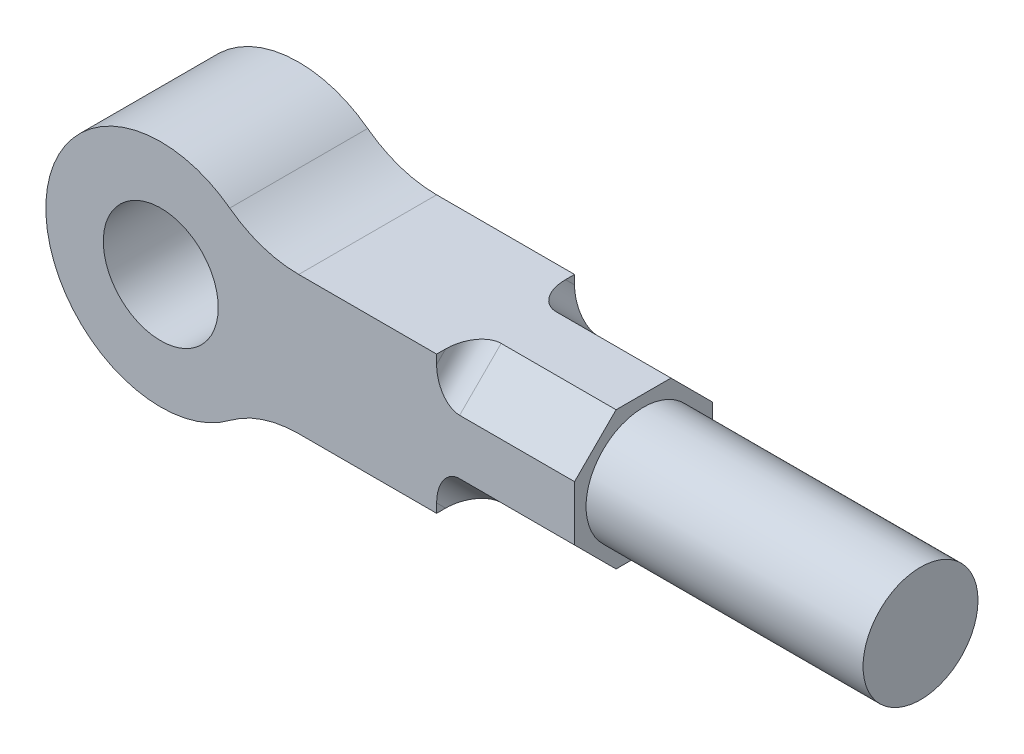
ISO-10303-21;
HEADER;
FILE_DESCRIPTION(('STEP AP214'),'2;1');
FILE_NAME('part.step','',(''),(''),'','','');
FILE_SCHEMA(('AUTOMOTIVE_DESIGN { 1 0 10303 214 1 1 1 1 }'));
ENDSEC;
DATA;
#1=APPLICATION_CONTEXT('core data for automotive mechanical design processes');
#2=APPLICATION_PROTOCOL_DEFINITION('international standard','automotive_design',2000,#1);
#3=PRODUCT_CONTEXT('',#1,'mechanical');
#4=PRODUCT('Part','Part','',(#3));
#5=PRODUCT_RELATED_PRODUCT_CATEGORY('part','',(#4));
#6=PRODUCT_DEFINITION_FORMATION('','',#4);
#7=PRODUCT_DEFINITION_CONTEXT('part definition',#1,'design');
#8=PRODUCT_DEFINITION('design','',#6,#7);
#9=PRODUCT_DEFINITION_SHAPE('','',#8);
#10=(LENGTH_UNIT() NAMED_UNIT(*) SI_UNIT(.MILLI.,.METRE.));
#11=(NAMED_UNIT(*) PLANE_ANGLE_UNIT() SI_UNIT($,.RADIAN.));
#12=(NAMED_UNIT(*) SI_UNIT($,.STERADIAN.) SOLID_ANGLE_UNIT());
#13=UNCERTAINTY_MEASURE_WITH_UNIT(LENGTH_MEASURE(1.E-05),#10,'distance_accuracy_value','');
#14=(GEOMETRIC_REPRESENTATION_CONTEXT(3) GLOBAL_UNCERTAINTY_ASSIGNED_CONTEXT((#13)) GLOBAL_UNIT_ASSIGNED_CONTEXT((#10,
#11,#12)) REPRESENTATION_CONTEXT('',''));
#15=CARTESIAN_POINT('',(0.,0.,0.));
#16=DIRECTION('',(0.,0.,1.));
#17=DIRECTION('',(1.,0.,0.));
#18=AXIS2_PLACEMENT_3D('',#15,#16,#17);
#19=CARTESIAN_POINT('',(60.,-80.,60.));
#20=DIRECTION('',(0.,0.,-1.));
#21=DIRECTION('',(-1.,0.,0.));
#22=AXIS2_PLACEMENT_3D('',#19,#20,#21);
#23=PLANE('',#22);
#24=DIRECTION('',(0.,-1.,0.));
#25=VECTOR('',#24,1.);
#26=CARTESIAN_POINT('',(120.,0.,60.));
#27=LINE('',#26,#25);
#28=CARTESIAN_POINT('',(120.,-26.0821356237304,60.));
#29=VERTEX_POINT('',#28);
#30=CARTESIAN_POINT('',(120.,-30.,60.));
#31=VERTEX_POINT('',#30);
#32=EDGE_CURVE('E294',#29,#31,#27,.T.);
#33=ORIENTED_EDGE('',*,*,#32,.F.);
#34=CARTESIAN_POINT('',(130.,-26.0821356237304,60.));
#35=DIRECTION('',(0.,0.,-1.));
#36=DIRECTION('',(0.,1.,0.));
#37=AXIS2_PLACEMENT_3D('',#34,#35,#36);
#38=ELLIPSE('',#37,14.142135623731,10.);
#39=CARTESIAN_POINT('',(130.,-11.9399999999994,60.));
#40=VERTEX_POINT('',#39);
#41=EDGE_CURVE('E239',#29,#40,#38,.T.);
#42=ORIENTED_EDGE('',*,*,#41,.T.);
#43=DIRECTION('',(1.,0.,0.));
#44=VECTOR('',#43,1.);
#45=CARTESIAN_POINT('',(120.,-11.9399999999994,60.));
#46=LINE('',#45,#44);
#47=CARTESIAN_POINT('',(180.,-11.9399999999994,60.));
#48=VERTEX_POINT('',#47);
#49=EDGE_CURVE('E285',#40,#48,#46,.T.);
#50=ORIENTED_EDGE('',*,*,#49,.T.);
#51=DIRECTION('',(0.,1.,0.));
#52=VECTOR('',#51,1.);
#53=CARTESIAN_POINT('',(180.,30.,60.));
#54=LINE('',#53,#52);
#55=CARTESIAN_POINT('',(180.,11.9399999999994,60.));
#56=VERTEX_POINT('',#55);
#57=EDGE_CURVE('E338',#48,#56,#54,.T.);
#58=ORIENTED_EDGE('',*,*,#57,.T.);
#59=DIRECTION('',(1.,0.,0.));
#60=VECTOR('',#59,1.);
#61=CARTESIAN_POINT('',(120.,11.9399999999994,60.));
#62=LINE('',#61,#60);
#63=CARTESIAN_POINT('',(130.,11.9399999999994,60.));
#64=VERTEX_POINT('',#63);
#65=EDGE_CURVE('E313',#64,#56,#62,.T.);
#66=ORIENTED_EDGE('',*,*,#65,.F.);
#67=CARTESIAN_POINT('',(130.,26.0821356237302,60.));
#68=DIRECTION('',(0.,0.,-1.));
#69=DIRECTION('',(0.,1.,0.));
#70=AXIS2_PLACEMENT_3D('',#67,#68,#69);
#71=ELLIPSE('',#70,14.1421356237308,10.);
#72=CARTESIAN_POINT('',(120.,26.0821356237302,60.));
#73=VERTEX_POINT('',#72);
#74=EDGE_CURVE('E11',#64,#73,#71,.T.);
#75=ORIENTED_EDGE('',*,*,#74,.T.);
#76=DIRECTION('',(0.,-1.,0.));
#77=VECTOR('',#76,1.);
#78=CARTESIAN_POINT('',(120.,0.,60.));
#79=LINE('',#78,#77);
#80=CARTESIAN_POINT('',(120.,30.,60.));
#81=VERTEX_POINT('',#80);
#82=EDGE_CURVE('E306',#81,#73,#79,.T.);
#83=ORIENTED_EDGE('',*,*,#82,.F.);
#84=DIRECTION('',(-1.,0.,0.));
#85=VECTOR('',#84,1.);
#86=CARTESIAN_POINT('',(60.,30.,60.));
#87=LINE('',#86,#85);
#88=CARTESIAN_POINT('',(60.,30.,60.));
#89=VERTEX_POINT('',#88);
#90=EDGE_CURVE('E342',#81,#89,#87,.T.);
#91=ORIENTED_EDGE('',*,*,#90,.T.);
#92=CARTESIAN_POINT('',(60.,80.,60.));
#93=DIRECTION('',(0.,0.,-1.));
#94=DIRECTION('',(-1.,0.,0.));
#95=AXIS2_PLACEMENT_3D('',#92,#93,#94);
#96=CIRCLE('',#95,50.);
#97=CARTESIAN_POINT('',(30.,40.,60.));
#98=VERTEX_POINT('',#97);
#99=EDGE_CURVE('E345',#89,#98,#96,.T.);
#100=ORIENTED_EDGE('',*,*,#99,.T.);
#101=CARTESIAN_POINT('',(0.,0.,60.));
#102=DIRECTION('',(0.,0.,1.));
#103=DIRECTION('',(1.,0.,0.));
#104=AXIS2_PLACEMENT_3D('',#101,#102,#103);
#105=CIRCLE('',#104,50.);
#106=CARTESIAN_POINT('',(30.,-40.,60.));
#107=VERTEX_POINT('',#106);
#108=EDGE_CURVE('E348',#98,#107,#105,.T.);
#109=ORIENTED_EDGE('',*,*,#108,.T.);
#110=CARTESIAN_POINT('',(60.,-80.,60.));
#111=DIRECTION('',(0.,0.,-1.));
#112=DIRECTION('',(-1.,0.,0.));
#113=AXIS2_PLACEMENT_3D('',#110,#111,#112);
#114=CIRCLE('',#113,50.);
#115=CARTESIAN_POINT('',(60.,-30.,60.));
#116=VERTEX_POINT('',#115);
#117=EDGE_CURVE('E329',#107,#116,#114,.T.);
#118=ORIENTED_EDGE('',*,*,#117,.T.);
#119=DIRECTION('',(1.,0.,0.));
#120=VECTOR('',#119,1.);
#121=CARTESIAN_POINT('',(60.,-30.,60.));
#122=LINE('',#121,#120);
#123=EDGE_CURVE('E333',#116,#31,#122,.T.);
#124=ORIENTED_EDGE('',*,*,#123,.T.);
#125=EDGE_LOOP('',(#33,#42,#50,#58,#66,#75,#83,#91,#100,#109,#118,#124));
#126=FACE_BOUND('',#125,.T.);
#127=CARTESIAN_POINT('',(0.,0.,60.));
#128=DIRECTION('',(0.,0.,1.));
#129=DIRECTION('',(1.,0.,0.));
#130=AXIS2_PLACEMENT_3D('',#127,#128,#129);
#131=CIRCLE('',#130,25.);
#132=CARTESIAN_POINT('',(25.,0.,60.));
#133=VERTEX_POINT('',#132);
#134=EDGE_CURVE('E321',#133,#133,#131,.T.);
#135=ORIENTED_EDGE('',*,*,#134,.F.);
#136=EDGE_LOOP('',(#135));
#137=FACE_BOUND('',#136,.T.);
#138=ADVANCED_FACE('F41',(#126,#137),#23,.F.);
#139=CARTESIAN_POINT('',(60.,-80.,0.));
#140=DIRECTION('',(0.,0.,-1.));
#141=DIRECTION('',(-1.,0.,0.));
#142=AXIS2_PLACEMENT_3D('',#139,#140,#141);
#143=PLANE('',#142);
#144=DIRECTION('',(1.,0.,0.));
#145=VECTOR('',#144,1.);
#146=CARTESIAN_POINT('',(120.,-11.9400000000004,0.));
#147=LINE('',#146,#145);
#148=CARTESIAN_POINT('',(130.,-11.9400000000004,0.));
#149=VERTEX_POINT('',#148);
#150=CARTESIAN_POINT('',(180.,-11.9400000000004,0.));
#151=VERTEX_POINT('',#150);
#152=EDGE_CURVE('E281',#149,#151,#147,.T.);
#153=ORIENTED_EDGE('',*,*,#152,.F.);
#154=CARTESIAN_POINT('',(130.,-26.0821356237313,0.));
#155=DIRECTION('',(0.,0.,-1.));
#156=DIRECTION('',(0.,-1.,0.));
#157=AXIS2_PLACEMENT_3D('',#154,#155,#156);
#158=ELLIPSE('',#157,14.1421356237309,10.);
#159=CARTESIAN_POINT('',(120.,-26.0821356237313,0.));
#160=VERTEX_POINT('',#159);
#161=EDGE_CURVE('E248',#149,#160,#158,.F.);
#162=ORIENTED_EDGE('',*,*,#161,.T.);
#163=DIRECTION('',(0.,1.,0.));
#164=VECTOR('',#163,1.);
#165=CARTESIAN_POINT('',(120.,0.,0.));
#166=LINE('',#165,#164);
#167=CARTESIAN_POINT('',(120.,-30.,0.));
#168=VERTEX_POINT('',#167);
#169=EDGE_CURVE('E273',#168,#160,#166,.T.);
#170=ORIENTED_EDGE('',*,*,#169,.F.);
#171=DIRECTION('',(1.,0.,0.));
#172=VECTOR('',#171,1.);
#173=CARTESIAN_POINT('',(60.,-30.,0.));
#174=LINE('',#173,#172);
#175=CARTESIAN_POINT('',(60.,-30.,0.));
#176=VERTEX_POINT('',#175);
#177=EDGE_CURVE('E355',#176,#168,#174,.T.);
#178=ORIENTED_EDGE('',*,*,#177,.F.);
#179=CARTESIAN_POINT('',(60.,-80.,0.));
#180=DIRECTION('',(0.,0.,-1.));
#181=DIRECTION('',(-1.,0.,0.));
#182=AXIS2_PLACEMENT_3D('',#179,#180,#181);
#183=CIRCLE('',#182,50.);
#184=CARTESIAN_POINT('',(30.,-40.,0.));
#185=VERTEX_POINT('',#184);
#186=EDGE_CURVE('E325',#185,#176,#183,.T.);
#187=ORIENTED_EDGE('',*,*,#186,.F.);
#188=CARTESIAN_POINT('',(0.,0.,0.));
#189=DIRECTION('',(0.,0.,1.));
#190=DIRECTION('',(1.,0.,0.));
#191=AXIS2_PLACEMENT_3D('',#188,#189,#190);
#192=CIRCLE('',#191,50.);
#193=CARTESIAN_POINT('',(30.,40.,0.));
#194=VERTEX_POINT('',#193);
#195=EDGE_CURVE('E334',#194,#185,#192,.T.);
#196=ORIENTED_EDGE('',*,*,#195,.F.);
#197=CARTESIAN_POINT('',(60.,80.,0.));
#198=DIRECTION('',(0.,0.,-1.));
#199=DIRECTION('',(-1.,0.,0.));
#200=AXIS2_PLACEMENT_3D('',#197,#198,#199);
#201=CIRCLE('',#200,50.);
#202=CARTESIAN_POINT('',(60.,30.,0.));
#203=VERTEX_POINT('',#202);
#204=EDGE_CURVE('E364',#203,#194,#201,.T.);
#205=ORIENTED_EDGE('',*,*,#204,.F.);
#206=DIRECTION('',(-1.,0.,0.));
#207=VECTOR('',#206,1.);
#208=CARTESIAN_POINT('',(60.,30.,0.));
#209=LINE('',#208,#207);
#210=CARTESIAN_POINT('',(120.,30.,0.));
#211=VERTEX_POINT('',#210);
#212=EDGE_CURVE('E361',#211,#203,#209,.T.);
#213=ORIENTED_EDGE('',*,*,#212,.F.);
#214=DIRECTION('',(0.,1.,0.));
#215=VECTOR('',#214,1.);
#216=CARTESIAN_POINT('',(120.,0.,0.));
#217=LINE('',#216,#215);
#218=CARTESIAN_POINT('',(120.,26.082135623731,0.));
#219=VERTEX_POINT('',#218);
#220=EDGE_CURVE('E177',#219,#211,#217,.T.);
#221=ORIENTED_EDGE('',*,*,#220,.F.);
#222=CARTESIAN_POINT('',(130.,26.0821356237309,0.));
#223=DIRECTION('',(0.,0.,-1.));
#224=DIRECTION('',(0.,-1.,0.));
#225=AXIS2_PLACEMENT_3D('',#222,#223,#224);
#226=ELLIPSE('',#225,14.1421356237309,10.);
#227=CARTESIAN_POINT('',(130.,11.94,0.));
#228=VERTEX_POINT('',#227);
#229=EDGE_CURVE('E251',#219,#228,#226,.F.);
#230=ORIENTED_EDGE('',*,*,#229,.T.);
#231=DIRECTION('',(1.,0.,0.));
#232=VECTOR('',#231,1.);
#233=CARTESIAN_POINT('',(120.,11.94,0.));
#234=LINE('',#233,#232);
#235=CARTESIAN_POINT('',(180.,11.94,0.));
#236=VERTEX_POINT('',#235);
#237=EDGE_CURVE('E176',#228,#236,#234,.T.);
#238=ORIENTED_EDGE('',*,*,#237,.T.);
#239=DIRECTION('',(0.,1.,0.));
#240=VECTOR('',#239,1.);
#241=CARTESIAN_POINT('',(180.,30.,0.));
#242=LINE('',#241,#240);
#243=EDGE_CURVE('E187',#151,#236,#242,.T.);
#244=ORIENTED_EDGE('',*,*,#243,.F.);
#245=EDGE_LOOP('',(#153,#162,#170,#178,#187,#196,#205,#213,#221,#230,#238,#244));
#246=FACE_BOUND('',#245,.T.);
#247=CARTESIAN_POINT('',(0.,0.,0.));
#248=DIRECTION('',(0.,0.,1.));
#249=DIRECTION('',(1.,0.,0.));
#250=AXIS2_PLACEMENT_3D('',#247,#248,#249);
#251=CIRCLE('',#250,25.);
#252=CARTESIAN_POINT('',(25.,0.,0.));
#253=VERTEX_POINT('',#252);
#254=EDGE_CURVE('E318',#253,#253,#251,.T.);
#255=ORIENTED_EDGE('',*,*,#254,.T.);
#256=EDGE_LOOP('',(#255));
#257=FACE_BOUND('',#256,.T.);
#258=ADVANCED_FACE('F385',(#246,#257),#143,.T.);
#259=CARTESIAN_POINT('',(60.,-80.,60.));
#260=DIRECTION('',(0.,0.,-1.));
#261=DIRECTION('',(-1.,0.,0.));
#262=AXIS2_PLACEMENT_3D('',#259,#260,#261);
#263=CYLINDRICAL_SURFACE('',#262,50.);
#264=ORIENTED_EDGE('',*,*,#186,.T.);
#265=DIRECTION('',(0.,0.,-1.));
#266=VECTOR('',#265,1.);
#267=CARTESIAN_POINT('',(60.,-30.,60.));
#268=LINE('',#267,#266);
#269=EDGE_CURVE('E202',#116,#176,#268,.T.);
#270=ORIENTED_EDGE('',*,*,#269,.F.);
#271=ORIENTED_EDGE('',*,*,#117,.F.);
#272=DIRECTION('',(0.,0.,-1.));
#273=VECTOR('',#272,1.);
#274=CARTESIAN_POINT('',(30.,-40.,60.));
#275=LINE('',#274,#273);
#276=EDGE_CURVE('E351',#107,#185,#275,.T.);
#277=ORIENTED_EDGE('',*,*,#276,.T.);
#278=EDGE_LOOP('',(#264,#270,#271,#277));
#279=FACE_BOUND('',#278,.T.);
#280=ADVANCED_FACE('F391',(#279),#263,.F.);
#281=CARTESIAN_POINT('',(60.,-30.,60.));
#282=DIRECTION('',(0.,1.,0.));
#283=DIRECTION('',(-1.,0.,0.));
#284=AXIS2_PLACEMENT_3D('',#281,#282,#283);
#285=PLANE('',#284);
#286=DIRECTION('',(0.,0.,-1.));
#287=VECTOR('',#286,1.);
#288=CARTESIAN_POINT('',(180.,-30.,60.));
#289=LINE('',#288,#287);
#290=CARTESIAN_POINT('',(180.,-30.,41.9399999999996));
#291=VERTEX_POINT('',#290);
#292=CARTESIAN_POINT('',(180.,-30.,18.0599999999997));
#293=VERTEX_POINT('',#292);
#294=EDGE_CURVE('E196',#291,#293,#289,.T.);
#295=ORIENTED_EDGE('',*,*,#294,.F.);
#296=DIRECTION('',(1.,0.,0.));
#297=VECTOR('',#296,1.);
#298=CARTESIAN_POINT('',(120.,-30.,41.9399999999996));
#299=LINE('',#298,#297);
#300=CARTESIAN_POINT('',(130.,-30.,41.9399999999996));
#301=VERTEX_POINT('',#300);
#302=EDGE_CURVE('E298',#301,#291,#299,.T.);
#303=ORIENTED_EDGE('',*,*,#302,.F.);
#304=CARTESIAN_POINT('',(130.,-30.,56.0821356237304));
#305=DIRECTION('',(0.,1.,0.));
#306=DIRECTION('',(0.,0.,1.));
#307=AXIS2_PLACEMENT_3D('',#304,#305,#306);
#308=ELLIPSE('',#307,14.1421356237309,10.);
#309=CARTESIAN_POINT('',(120.,-30.,56.0821356237305));
#310=VERTEX_POINT('',#309);
#311=EDGE_CURVE('E242',#301,#310,#308,.T.);
#312=ORIENTED_EDGE('',*,*,#311,.T.);
#313=DIRECTION('',(0.,0.,-1.));
#314=VECTOR('',#313,1.);
#315=CARTESIAN_POINT('',(120.,-30.,0.));
#316=LINE('',#315,#314);
#317=EDGE_CURVE('E290',#31,#310,#316,.T.);
#318=ORIENTED_EDGE('',*,*,#317,.F.);
#319=ORIENTED_EDGE('',*,*,#123,.F.);
#320=ORIENTED_EDGE('',*,*,#269,.T.);
#321=ORIENTED_EDGE('',*,*,#177,.T.);
#322=DIRECTION('',(0.,0.,-1.));
#323=VECTOR('',#322,1.);
#324=CARTESIAN_POINT('',(120.,-30.,0.));
#325=LINE('',#324,#323);
#326=CARTESIAN_POINT('',(120.,-30.,3.91786437626871));
#327=VERTEX_POINT('',#326);
#328=EDGE_CURVE('E277',#327,#168,#325,.T.);
#329=ORIENTED_EDGE('',*,*,#328,.F.);
#330=CARTESIAN_POINT('',(130.,-30.,3.91786437626873));
#331=DIRECTION('',(0.,1.,0.));
#332=DIRECTION('',(0.,0.,1.));
#333=AXIS2_PLACEMENT_3D('',#330,#331,#332);
#334=ELLIPSE('',#333,14.142135623731,10.);
#335=CARTESIAN_POINT('',(130.,-30.,18.0599999999997));
#336=VERTEX_POINT('',#335);
#337=EDGE_CURVE('E245',#327,#336,#334,.T.);
#338=ORIENTED_EDGE('',*,*,#337,.T.);
#339=DIRECTION('',(1.,0.,0.));
#340=VECTOR('',#339,1.);
#341=CARTESIAN_POINT('',(120.,-30.,18.0599999999997));
#342=LINE('',#341,#340);
#343=EDGE_CURVE('E190',#336,#293,#342,.T.);
#344=ORIENTED_EDGE('',*,*,#343,.T.);
#345=EDGE_LOOP('',(#295,#303,#312,#318,#319,#320,#321,#329,#338,#344));
#346=FACE_BOUND('',#345,.T.);
#347=ADVANCED_FACE('F435',(#346),#285,.F.);
#348=CARTESIAN_POINT('',(180.,30.,60.));
#349=DIRECTION('',(-1.,0.,0.));
#350=DIRECTION('',(0.,0.,1.));
#351=AXIS2_PLACEMENT_3D('',#348,#349,#350);
#352=PLANE('',#351);
#353=CARTESIAN_POINT('',(180.,0.,30.));
#354=DIRECTION('',(1.,0.,0.));
#355=DIRECTION('',(0.,0.,-1.));
#356=AXIS2_PLACEMENT_3D('',#353,#354,#355);
#357=CIRCLE('',#356,25.);
#358=CARTESIAN_POINT('',(180.,0.,5.));
#359=VERTEX_POINT('',#358);
#360=EDGE_CURVE('E212',#359,#359,#357,.T.);
#361=ORIENTED_EDGE('',*,*,#360,.F.);
#362=EDGE_LOOP('',(#361));
#363=FACE_BOUND('',#362,.T.);
#364=ORIENTED_EDGE('',*,*,#57,.F.);
#365=DIRECTION('',(0.,0.707106781186552,0.707106781186543));
#366=VECTOR('',#365,1.);
#367=CARTESIAN_POINT('',(180.,-35.9699999999996,35.9700000000001));
#368=LINE('',#367,#366);
#369=EDGE_CURVE('E295',#291,#48,#368,.T.);
#370=ORIENTED_EDGE('',*,*,#369,.F.);
#371=ORIENTED_EDGE('',*,*,#294,.T.);
#372=DIRECTION('',(0.,-0.707106781186545,0.70710678118655));
#373=VECTOR('',#372,1.);
#374=CARTESIAN_POINT('',(180.,-5.97000000000024,-5.9700000000002));
#375=LINE('',#374,#373);
#376=EDGE_CURVE('E278',#151,#293,#375,.T.);
#377=ORIENTED_EDGE('',*,*,#376,.F.);
#378=ORIENTED_EDGE('',*,*,#243,.T.);
#379=DIRECTION('',(0.,-0.707106781186548,-0.707106781186548));
#380=VECTOR('',#379,1.);
#381=CARTESIAN_POINT('',(180.,5.97,-5.97));
#382=LINE('',#381,#380);
#383=CARTESIAN_POINT('',(180.,30.,18.06));
#384=VERTEX_POINT('',#383);
#385=EDGE_CURVE('E169',#384,#236,#382,.T.);
#386=ORIENTED_EDGE('',*,*,#385,.F.);
#387=DIRECTION('',(0.,0.,-1.));
#388=VECTOR('',#387,1.);
#389=CARTESIAN_POINT('',(180.,30.,60.));
#390=LINE('',#389,#388);
#391=CARTESIAN_POINT('',(180.,30.,41.939999999999));
#392=VERTEX_POINT('',#391);
#393=EDGE_CURVE('E184',#392,#384,#390,.T.);
#394=ORIENTED_EDGE('',*,*,#393,.F.);
#395=DIRECTION('',(0.,0.70710678118654,-0.707106781186555));
#396=VECTOR('',#395,1.);
#397=CARTESIAN_POINT('',(180.,35.9699999999998,35.969999999999));
#398=LINE('',#397,#396);
#399=EDGE_CURVE('E271',#56,#392,#398,.T.);
#400=ORIENTED_EDGE('',*,*,#399,.F.);
#401=EDGE_LOOP('',(#364,#370,#371,#377,#378,#386,#394,#400));
#402=FACE_BOUND('',#401,.T.);
#403=ADVANCED_FACE('F182',(#363,#402),#352,.F.);
#404=CARTESIAN_POINT('',(60.,30.,60.));
#405=DIRECTION('',(0.,-1.,0.));
#406=DIRECTION('',(1.,0.,0.));
#407=AXIS2_PLACEMENT_3D('',#404,#405,#406);
#408=PLANE('',#407);
#409=ORIENTED_EDGE('',*,*,#393,.T.);
#410=DIRECTION('',(1.,0.,0.));
#411=VECTOR('',#410,1.);
#412=CARTESIAN_POINT('',(120.,30.,18.06));
#413=LINE('',#412,#411);
#414=CARTESIAN_POINT('',(130.,30.,18.06));
#415=VERTEX_POINT('',#414);
#416=EDGE_CURVE('E165',#415,#384,#413,.T.);
#417=ORIENTED_EDGE('',*,*,#416,.F.);
#418=CARTESIAN_POINT('',(130.,30.,3.91786437626906));
#419=DIRECTION('',(0.,-1.,0.));
#420=DIRECTION('',(0.,0.,-1.));
#421=AXIS2_PLACEMENT_3D('',#418,#419,#420);
#422=ELLIPSE('',#421,14.1421356237309,10.);
#423=CARTESIAN_POINT('',(120.,30.,3.91786437626905));
#424=VERTEX_POINT('',#423);
#425=EDGE_CURVE('E254',#415,#424,#422,.T.);
#426=ORIENTED_EDGE('',*,*,#425,.T.);
#427=DIRECTION('',(0.,0.,1.));
#428=VECTOR('',#427,1.);
#429=CARTESIAN_POINT('',(120.,30.,0.));
#430=LINE('',#429,#428);
#431=EDGE_CURVE('E189',#211,#424,#430,.T.);
#432=ORIENTED_EDGE('',*,*,#431,.F.);
#433=ORIENTED_EDGE('',*,*,#212,.T.);
#434=DIRECTION('',(0.,0.,-1.));
#435=VECTOR('',#434,1.);
#436=CARTESIAN_POINT('',(60.,30.,60.));
#437=LINE('',#436,#435);
#438=EDGE_CURVE('E197',#89,#203,#437,.T.);
#439=ORIENTED_EDGE('',*,*,#438,.F.);
#440=ORIENTED_EDGE('',*,*,#90,.F.);
#441=DIRECTION('',(0.,0.,1.));
#442=VECTOR('',#441,1.);
#443=CARTESIAN_POINT('',(120.,30.,0.));
#444=LINE('',#443,#442);
#445=CARTESIAN_POINT('',(120.,30.,56.0821356237301));
#446=VERTEX_POINT('',#445);
#447=EDGE_CURVE('E310',#446,#81,#444,.T.);
#448=ORIENTED_EDGE('',*,*,#447,.F.);
#449=CARTESIAN_POINT('',(130.,30.,56.0821356237301));
#450=DIRECTION('',(0.,-1.,0.));
#451=DIRECTION('',(0.,0.,-1.));
#452=AXIS2_PLACEMENT_3D('',#449,#450,#451);
#453=ELLIPSE('',#452,14.1421356237311,10.);
#454=CARTESIAN_POINT('',(130.,30.,41.939999999999));
#455=VERTEX_POINT('',#454);
#456=EDGE_CURVE('E50',#446,#455,#453,.T.);
#457=ORIENTED_EDGE('',*,*,#456,.T.);
#458=DIRECTION('',(1.,0.,0.));
#459=VECTOR('',#458,1.);
#460=CARTESIAN_POINT('',(120.,30.,41.939999999999));
#461=LINE('',#460,#459);
#462=EDGE_CURVE('E193',#455,#392,#461,.T.);
#463=ORIENTED_EDGE('',*,*,#462,.T.);
#464=EDGE_LOOP('',(#409,#417,#426,#432,#433,#439,#440,#448,#457,#463));
#465=FACE_BOUND('',#464,.T.);
#466=ADVANCED_FACE('F192',(#465),#408,.F.);
#467=CARTESIAN_POINT('',(60.,80.,60.));
#468=DIRECTION('',(0.,0.,-1.));
#469=DIRECTION('',(-1.,0.,0.));
#470=AXIS2_PLACEMENT_3D('',#467,#468,#469);
#471=CYLINDRICAL_SURFACE('',#470,50.);
#472=ORIENTED_EDGE('',*,*,#204,.T.);
#473=DIRECTION('',(0.,0.,-1.));
#474=VECTOR('',#473,1.);
#475=CARTESIAN_POINT('',(30.,40.,60.));
#476=LINE('',#475,#474);
#477=EDGE_CURVE('E205',#98,#194,#476,.T.);
#478=ORIENTED_EDGE('',*,*,#477,.F.);
#479=ORIENTED_EDGE('',*,*,#99,.F.);
#480=ORIENTED_EDGE('',*,*,#438,.T.);
#481=EDGE_LOOP('',(#472,#478,#479,#480));
#482=FACE_BOUND('',#481,.T.);
#483=ADVANCED_FACE('F399',(#482),#471,.F.);
#484=CARTESIAN_POINT('',(0.,0.,60.));
#485=DIRECTION('',(0.,0.,-1.));
#486=DIRECTION('',(-1.,0.,0.));
#487=AXIS2_PLACEMENT_3D('',#484,#485,#486);
#488=CYLINDRICAL_SURFACE('',#487,50.);
#489=ORIENTED_EDGE('',*,*,#195,.T.);
#490=ORIENTED_EDGE('',*,*,#276,.F.);
#491=ORIENTED_EDGE('',*,*,#108,.F.);
#492=ORIENTED_EDGE('',*,*,#477,.T.);
#493=EDGE_LOOP('',(#489,#490,#491,#492));
#494=FACE_BOUND('',#493,.T.);
#495=ADVANCED_FACE('F377',(#494),#488,.T.);
#496=CARTESIAN_POINT('',(0.,0.,60.));
#497=DIRECTION('',(0.,0.,-1.));
#498=DIRECTION('',(-1.,0.,0.));
#499=AXIS2_PLACEMENT_3D('',#496,#497,#498);
#500=CYLINDRICAL_SURFACE('',#499,25.);
#501=ORIENTED_EDGE('',*,*,#134,.T.);
#502=EDGE_LOOP('',(#501));
#503=FACE_BOUND('',#502,.T.);
#504=ORIENTED_EDGE('',*,*,#254,.F.);
#505=EDGE_LOOP('',(#504));
#506=FACE_BOUND('',#505,.T.);
#507=ADVANCED_FACE('F424',(#503,#506),#500,.F.);
#508=CARTESIAN_POINT('',(120.,35.9699999999998,35.969999999999));
#509=DIRECTION('',(0.,-0.707106781186555,-0.70710678118654));
#510=DIRECTION('',(0.,0.70710678118654,-0.707106781186555));
#511=AXIS2_PLACEMENT_3D('',#508,#509,#510);
#512=PLANE('',#511);
#513=ORIENTED_EDGE('',*,*,#462,.F.);
#514=DIRECTION('',(0.,0.70710678118654,-0.707106781186555));
#515=VECTOR('',#514,1.);
#516=CARTESIAN_POINT('',(130.,35.9699999999998,35.969999999999));
#517=LINE('',#516,#515);
#518=EDGE_CURVE('E57',#455,#64,#517,.F.);
#519=ORIENTED_EDGE('',*,*,#518,.T.);
#520=ORIENTED_EDGE('',*,*,#65,.T.);
#521=ORIENTED_EDGE('',*,*,#399,.T.);
#522=EDGE_LOOP('',(#513,#519,#520,#521));
#523=FACE_BOUND('',#522,.T.);
#524=ADVANCED_FACE('F468',(#523),#512,.F.);
#525=CARTESIAN_POINT('',(120.,0.,0.));
#526=DIRECTION('',(1.,0.,0.));
#527=DIRECTION('',(0.,0.,-1.));
#528=AXIS2_PLACEMENT_3D('',#525,#526,#527);
#529=PLANE('',#528);
#530=ORIENTED_EDGE('',*,*,#82,.T.);
#531=DIRECTION('',(0.,0.70710678118654,-0.707106781186555));
#532=VECTOR('',#531,1.);
#533=CARTESIAN_POINT('',(120.,43.0410678118654,43.0410678118645));
#534=LINE('',#533,#532);
#535=EDGE_CURVE('E233',#73,#446,#534,.T.);
#536=ORIENTED_EDGE('',*,*,#535,.T.);
#537=ORIENTED_EDGE('',*,*,#447,.T.);
#538=EDGE_LOOP('',(#530,#536,#537));
#539=FACE_BOUND('',#538,.T.);
#540=ADVANCED_FACE('F466',(#539),#529,.T.);
#541=CARTESIAN_POINT('',(120.,5.97,-5.97));
#542=DIRECTION('',(0.,-0.707106781186547,0.707106781186547));
#543=DIRECTION('',(0.,-0.707106781186548,-0.707106781186548));
#544=AXIS2_PLACEMENT_3D('',#541,#542,#543);
#545=PLANE('',#544);
#546=ORIENTED_EDGE('',*,*,#237,.F.);
#547=DIRECTION('',(0.,-0.707106781186548,-0.707106781186548));
#548=VECTOR('',#547,1.);
#549=CARTESIAN_POINT('',(130.,5.97,-5.97));
#550=LINE('',#549,#548);
#551=EDGE_CURVE('E172',#228,#415,#550,.F.);
#552=ORIENTED_EDGE('',*,*,#551,.T.);
#553=ORIENTED_EDGE('',*,*,#416,.T.);
#554=ORIENTED_EDGE('',*,*,#385,.T.);
#555=EDGE_LOOP('',(#546,#552,#553,#554));
#556=FACE_BOUND('',#555,.T.);
#557=ADVANCED_FACE('F168',(#556),#545,.F.);
#558=CARTESIAN_POINT('',(120.,0.,0.));
#559=DIRECTION('',(1.,0.,0.));
#560=DIRECTION('',(0.,0.,-1.));
#561=AXIS2_PLACEMENT_3D('',#558,#559,#560);
#562=PLANE('',#561);
#563=ORIENTED_EDGE('',*,*,#431,.T.);
#564=DIRECTION('',(0.,-0.707106781186548,-0.707106781186548));
#565=VECTOR('',#564,1.);
#566=CARTESIAN_POINT('',(120.,13.0410678118655,-13.0410678118655));
#567=LINE('',#566,#565);
#568=EDGE_CURVE('E227',#424,#219,#567,.T.);
#569=ORIENTED_EDGE('',*,*,#568,.T.);
#570=ORIENTED_EDGE('',*,*,#220,.T.);
#571=EDGE_LOOP('',(#563,#569,#570));
#572=FACE_BOUND('',#571,.T.);
#573=ADVANCED_FACE('F403',(#572),#562,.T.);
#574=CARTESIAN_POINT('',(120.,-5.97000000000024,-5.9700000000002));
#575=DIRECTION('',(0.,0.70710678118655,0.707106781186545));
#576=DIRECTION('',(0.,-0.707106781186545,0.70710678118655));
#577=AXIS2_PLACEMENT_3D('',#574,#575,#576);
#578=PLANE('',#577);
#579=ORIENTED_EDGE('',*,*,#343,.F.);
#580=DIRECTION('',(0.,-0.707106781186545,0.70710678118655));
#581=VECTOR('',#580,1.);
#582=CARTESIAN_POINT('',(130.,-5.97000000000024,-5.9700000000002));
#583=LINE('',#582,#581);
#584=EDGE_CURVE('E224',#336,#149,#583,.F.);
#585=ORIENTED_EDGE('',*,*,#584,.T.);
#586=ORIENTED_EDGE('',*,*,#152,.T.);
#587=ORIENTED_EDGE('',*,*,#376,.T.);
#588=EDGE_LOOP('',(#579,#585,#586,#587));
#589=FACE_BOUND('',#588,.T.);
#590=ADVANCED_FACE('F481',(#589),#578,.F.);
#591=CARTESIAN_POINT('',(120.,0.,0.));
#592=DIRECTION('',(1.,0.,0.));
#593=DIRECTION('',(0.,0.,-1.));
#594=AXIS2_PLACEMENT_3D('',#591,#592,#593);
#595=PLANE('',#594);
#596=ORIENTED_EDGE('',*,*,#169,.T.);
#597=DIRECTION('',(0.,-0.707106781186545,0.70710678118655));
#598=VECTOR('',#597,1.);
#599=CARTESIAN_POINT('',(120.,-13.0410678118657,-13.0410678118657));
#600=LINE('',#599,#598);
#601=EDGE_CURVE('E220',#160,#327,#600,.T.);
#602=ORIENTED_EDGE('',*,*,#601,.T.);
#603=ORIENTED_EDGE('',*,*,#328,.T.);
#604=EDGE_LOOP('',(#596,#602,#603));
#605=FACE_BOUND('',#604,.T.);
#606=ADVANCED_FACE('F478',(#605),#595,.T.);
#607=CARTESIAN_POINT('',(120.,-35.9699999999996,35.9700000000001));
#608=DIRECTION('',(0.,0.707106781186543,-0.707106781186552));
#609=DIRECTION('',(0.,0.707106781186552,0.707106781186543));
#610=AXIS2_PLACEMENT_3D('',#607,#608,#609);
#611=PLANE('',#610);
#612=ORIENTED_EDGE('',*,*,#49,.F.);
#613=DIRECTION('',(0.,0.707106781186552,0.707106781186543));
#614=VECTOR('',#613,1.);
#615=CARTESIAN_POINT('',(130.,-35.9699999999996,35.9700000000001));
#616=LINE('',#615,#614);
#617=EDGE_CURVE('E217',#40,#301,#616,.F.);
#618=ORIENTED_EDGE('',*,*,#617,.T.);
#619=ORIENTED_EDGE('',*,*,#302,.T.);
#620=ORIENTED_EDGE('',*,*,#369,.T.);
#621=EDGE_LOOP('',(#612,#618,#619,#620));
#622=FACE_BOUND('',#621,.T.);
#623=ADVANCED_FACE('F461',(#622),#611,.F.);
#624=CARTESIAN_POINT('',(120.,0.,0.));
#625=DIRECTION('',(1.,0.,0.));
#626=DIRECTION('',(0.,0.,-1.));
#627=AXIS2_PLACEMENT_3D('',#624,#625,#626);
#628=PLANE('',#627);
#629=ORIENTED_EDGE('',*,*,#317,.T.);
#630=DIRECTION('',(0.,0.707106781186552,0.707106781186543));
#631=VECTOR('',#630,1.);
#632=CARTESIAN_POINT('',(120.,-43.041067811865,43.0410678118656));
#633=LINE('',#632,#631);
#634=EDGE_CURVE('E213',#310,#29,#633,.T.);
#635=ORIENTED_EDGE('',*,*,#634,.T.);
#636=ORIENTED_EDGE('',*,*,#32,.T.);
#637=EDGE_LOOP('',(#629,#635,#636));
#638=FACE_BOUND('',#637,.T.);
#639=ADVANCED_FACE('F458',(#638),#628,.T.);
#640=CARTESIAN_POINT('',(300.5,0.,30.));
#641=DIRECTION('',(-1.,0.,0.));
#642=DIRECTION('',(0.,0.,1.));
#643=AXIS2_PLACEMENT_3D('',#640,#641,#642);
#644=CYLINDRICAL_SURFACE('',#643,25.);
#645=CARTESIAN_POINT('',(300.5,0.,30.));
#646=DIRECTION('',(1.,0.,0.));
#647=DIRECTION('',(0.,0.,-1.));
#648=AXIS2_PLACEMENT_3D('',#645,#646,#647);
#649=CIRCLE('',#648,25.);
#650=CARTESIAN_POINT('',(300.5,0.,5.));
#651=VERTEX_POINT('',#650);
#652=EDGE_CURVE('E264',#651,#651,#649,.T.);
#653=ORIENTED_EDGE('',*,*,#652,.F.);
#654=EDGE_LOOP('',(#653));
#655=FACE_BOUND('',#654,.T.);
#656=ORIENTED_EDGE('',*,*,#360,.T.);
#657=EDGE_LOOP('',(#656));
#658=FACE_BOUND('',#657,.T.);
#659=ADVANCED_FACE('F448',(#655,#658),#644,.T.);
#660=CARTESIAN_POINT('',(300.5,0.,0.));
#661=DIRECTION('',(1.,0.,0.));
#662=DIRECTION('',(0.,0.,-1.));
#663=AXIS2_PLACEMENT_3D('',#660,#661,#662);
#664=PLANE('',#663);
#665=ORIENTED_EDGE('',*,*,#652,.T.);
#666=EDGE_LOOP('',(#665));
#667=FACE_BOUND('',#666,.T.);
#668=ADVANCED_FACE('F443',(#667),#664,.T.);
#669=CARTESIAN_POINT('',(130.,-43.041067811865,43.0410678118656));
#670=DIRECTION('',(0.,0.707106781186552,0.707106781186543));
#671=DIRECTION('',(0.,-0.707106781186543,0.707106781186552));
#672=AXIS2_PLACEMENT_3D('',#669,#670,#671);
#673=CYLINDRICAL_SURFACE('',#672,10.);
#674=ORIENTED_EDGE('',*,*,#311,.F.);
#675=ORIENTED_EDGE('',*,*,#617,.F.);
#676=ORIENTED_EDGE('',*,*,#41,.F.);
#677=ORIENTED_EDGE('',*,*,#634,.F.);
#678=EDGE_LOOP('',(#674,#675,#676,#677));
#679=FACE_BOUND('',#678,.T.);
#680=ADVANCED_FACE('F414',(#679),#673,.F.);
#681=CARTESIAN_POINT('',(130.,-13.0410678118657,-13.0410678118657));
#682=DIRECTION('',(0.,-0.707106781186545,0.70710678118655));
#683=DIRECTION('',(0.,-0.70710678118655,-0.707106781186545));
#684=AXIS2_PLACEMENT_3D('',#681,#682,#683);
#685=CYLINDRICAL_SURFACE('',#684,10.);
#686=ORIENTED_EDGE('',*,*,#161,.F.);
#687=ORIENTED_EDGE('',*,*,#584,.F.);
#688=ORIENTED_EDGE('',*,*,#337,.F.);
#689=ORIENTED_EDGE('',*,*,#601,.F.);
#690=EDGE_LOOP('',(#686,#687,#688,#689));
#691=FACE_BOUND('',#690,.T.);
#692=ADVANCED_FACE('F408',(#691),#685,.F.);
#693=CARTESIAN_POINT('',(130.,13.0410678118655,-13.0410678118655));
#694=DIRECTION('',(0.,-0.707106781186548,-0.707106781186548));
#695=DIRECTION('',(0.,0.707106781186548,-0.707106781186548));
#696=AXIS2_PLACEMENT_3D('',#693,#694,#695);
#697=CYLINDRICAL_SURFACE('',#696,10.);
#698=ORIENTED_EDGE('',*,*,#425,.F.);
#699=ORIENTED_EDGE('',*,*,#551,.F.);
#700=ORIENTED_EDGE('',*,*,#229,.F.);
#701=ORIENTED_EDGE('',*,*,#568,.F.);
#702=EDGE_LOOP('',(#698,#699,#700,#701));
#703=FACE_BOUND('',#702,.T.);
#704=ADVANCED_FACE('F406',(#703),#697,.F.);
#705=CARTESIAN_POINT('',(130.,43.0410678118654,43.0410678118644));
#706=DIRECTION('',(0.,0.70710678118654,-0.707106781186555));
#707=DIRECTION('',(0.,0.707106781186555,0.70710678118654));
#708=AXIS2_PLACEMENT_3D('',#705,#706,#707);
#709=CYLINDRICAL_SURFACE('',#708,10.);
#710=ORIENTED_EDGE('',*,*,#74,.F.);
#711=ORIENTED_EDGE('',*,*,#518,.F.);
#712=ORIENTED_EDGE('',*,*,#456,.F.);
#713=ORIENTED_EDGE('',*,*,#535,.F.);
#714=EDGE_LOOP('',(#710,#711,#712,#713));
#715=FACE_BOUND('',#714,.T.);
#716=ADVANCED_FACE('F43',(#715),#709,.F.);
#717=CLOSED_SHELL('',(#138,#258,#280,#347,#403,#466,#483,#495,#507,#524,#540,#557,#573,#590,
#606,#623,#639,#659,#668,#680,#692,#704,#716));
#718=MANIFOLD_SOLID_BREP('B2',#717);
#719=ADVANCED_BREP_SHAPE_REPRESENTATION('',(#18,#718),#14);
#720=SHAPE_DEFINITION_REPRESENTATION(#9,#719);
ENDSEC;
END-ISO-10303-21;
